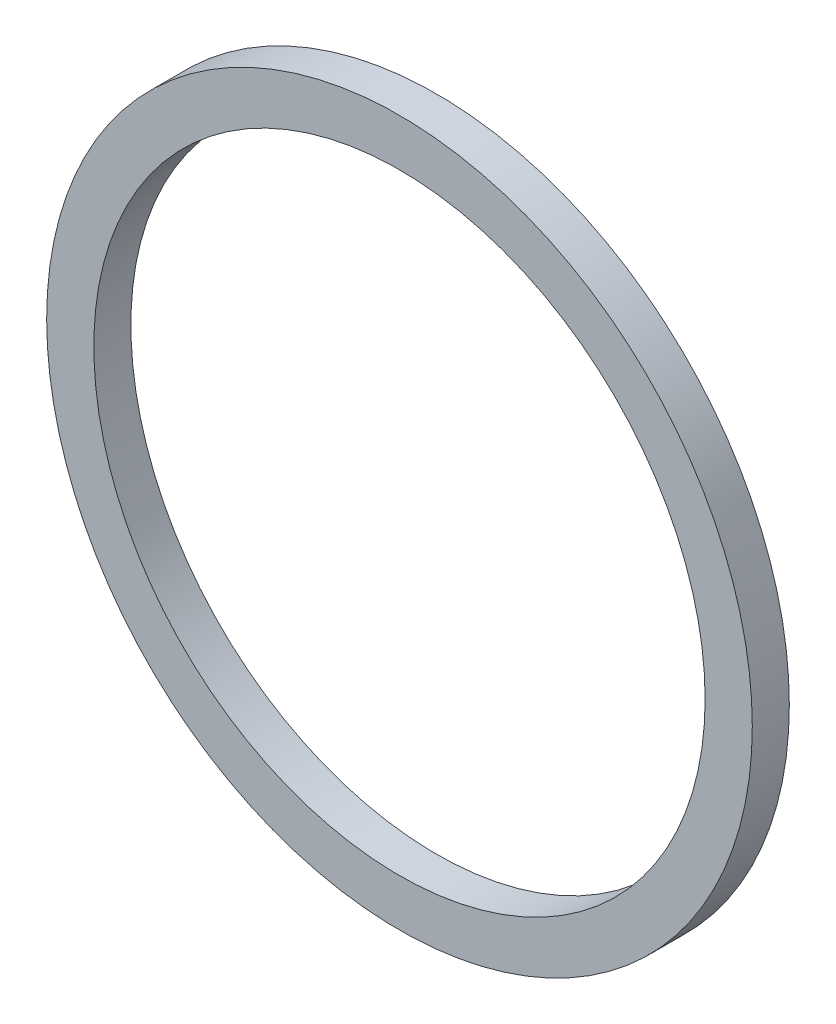
ISO-10303-21;
HEADER;
FILE_DESCRIPTION(('STEP AP214'),'2;1');
FILE_NAME('part.step','',(''),(''),'','','');
FILE_SCHEMA(('AUTOMOTIVE_DESIGN { 1 0 10303 214 1 1 1 1 }'));
ENDSEC;
DATA;
#1=APPLICATION_CONTEXT('core data for automotive mechanical design processes');
#2=APPLICATION_PROTOCOL_DEFINITION('international standard','automotive_design',2000,#1);
#3=PRODUCT_CONTEXT('',#1,'mechanical');
#4=PRODUCT('Part','Part','',(#3));
#5=PRODUCT_RELATED_PRODUCT_CATEGORY('part','',(#4));
#6=PRODUCT_DEFINITION_FORMATION('','',#4);
#7=PRODUCT_DEFINITION_CONTEXT('part definition',#1,'design');
#8=PRODUCT_DEFINITION('design','',#6,#7);
#9=PRODUCT_DEFINITION_SHAPE('','',#8);
#10=(LENGTH_UNIT() NAMED_UNIT(*) SI_UNIT(.MILLI.,.METRE.));
#11=(NAMED_UNIT(*) PLANE_ANGLE_UNIT() SI_UNIT($,.RADIAN.));
#12=(NAMED_UNIT(*) SI_UNIT($,.STERADIAN.) SOLID_ANGLE_UNIT());
#13=UNCERTAINTY_MEASURE_WITH_UNIT(LENGTH_MEASURE(1.E-05),#10,'distance_accuracy_value','');
#14=(GEOMETRIC_REPRESENTATION_CONTEXT(3) GLOBAL_UNCERTAINTY_ASSIGNED_CONTEXT((#13)) GLOBAL_UNIT_ASSIGNED_CONTEXT((#10,
#11,#12)) REPRESENTATION_CONTEXT('',''));
#15=CARTESIAN_POINT('',(0.,0.,0.));
#16=DIRECTION('',(0.,0.,1.));
#17=DIRECTION('',(1.,0.,0.));
#18=AXIS2_PLACEMENT_3D('',#15,#16,#17);
#19=CARTESIAN_POINT('',(0.,0.,-2.2));
#20=DIRECTION('',(0.,0.,1.));
#21=DIRECTION('',(1.,0.,0.));
#22=AXIS2_PLACEMENT_3D('',#19,#20,#21);
#23=CYLINDRICAL_SURFACE('',#22,20.95);
#24=CARTESIAN_POINT('',(0.,0.,-2.2));
#25=DIRECTION('',(0.,0.,1.));
#26=DIRECTION('',(1.,0.,0.));
#27=AXIS2_PLACEMENT_3D('',#24,#25,#26);
#28=CIRCLE('',#27,20.95);
#29=CARTESIAN_POINT('',(20.95,0.,-2.2));
#30=VERTEX_POINT('',#29);
#31=EDGE_CURVE('E10',#30,#30,#28,.T.);
#32=ORIENTED_EDGE('',*,*,#31,.T.);
#33=EDGE_LOOP('',(#32));
#34=FACE_BOUND('',#33,.T.);
#35=CARTESIAN_POINT('',(0.,0.,0.));
#36=DIRECTION('',(0.,0.,1.));
#37=DIRECTION('',(1.,0.,0.));
#38=AXIS2_PLACEMENT_3D('',#35,#36,#37);
#39=CIRCLE('',#38,20.95);
#40=CARTESIAN_POINT('',(20.95,0.,0.));
#41=VERTEX_POINT('',#40);
#42=EDGE_CURVE('E36',#41,#41,#39,.T.);
#43=ORIENTED_EDGE('',*,*,#42,.F.);
#44=EDGE_LOOP('',(#43));
#45=FACE_BOUND('',#44,.T.);
#46=ADVANCED_FACE('F33',(#34,#45),#23,.T.);
#47=CARTESIAN_POINT('',(0.,0.,-2.2));
#48=DIRECTION('',(0.,0.,1.));
#49=DIRECTION('',(1.,0.,0.));
#50=AXIS2_PLACEMENT_3D('',#47,#48,#49);
#51=PLANE('',#50);
#52=CARTESIAN_POINT('',(0.,0.,-2.2));
#53=DIRECTION('',(0.,0.,1.));
#54=DIRECTION('',(1.,0.,0.));
#55=AXIS2_PLACEMENT_3D('',#52,#53,#54);
#56=CIRCLE('',#55,18.15);
#57=CARTESIAN_POINT('',(18.15,0.,-2.2));
#58=VERTEX_POINT('',#57);
#59=EDGE_CURVE('E43',#58,#58,#56,.T.);
#60=ORIENTED_EDGE('',*,*,#59,.T.);
#61=EDGE_LOOP('',(#60));
#62=FACE_BOUND('',#61,.T.);
#63=ORIENTED_EDGE('',*,*,#31,.F.);
#64=EDGE_LOOP('',(#63));
#65=FACE_BOUND('',#64,.T.);
#66=ADVANCED_FACE('F51',(#62,#65),#51,.F.);
#67=CARTESIAN_POINT('',(0.,0.,0.));
#68=DIRECTION('',(0.,0.,1.));
#69=DIRECTION('',(1.,0.,0.));
#70=AXIS2_PLACEMENT_3D('',#67,#68,#69);
#71=PLANE('',#70);
#72=CARTESIAN_POINT('',(0.,0.,0.));
#73=DIRECTION('',(0.,0.,1.));
#74=DIRECTION('',(1.,0.,0.));
#75=AXIS2_PLACEMENT_3D('',#72,#73,#74);
#76=CIRCLE('',#75,18.15);
#77=CARTESIAN_POINT('',(18.15,0.,0.));
#78=VERTEX_POINT('',#77);
#79=EDGE_CURVE('E45',#78,#78,#76,.T.);
#80=ORIENTED_EDGE('',*,*,#79,.F.);
#81=EDGE_LOOP('',(#80));
#82=FACE_BOUND('',#81,.T.);
#83=ORIENTED_EDGE('',*,*,#42,.T.);
#84=EDGE_LOOP('',(#83));
#85=FACE_BOUND('',#84,.T.);
#86=ADVANCED_FACE('F57',(#82,#85),#71,.T.);
#87=CARTESIAN_POINT('',(0.,0.,-2.2));
#88=DIRECTION('',(0.,0.,1.));
#89=DIRECTION('',(1.,0.,0.));
#90=AXIS2_PLACEMENT_3D('',#87,#88,#89);
#91=CYLINDRICAL_SURFACE('',#90,18.15);
#92=ORIENTED_EDGE('',*,*,#59,.F.);
#93=EDGE_LOOP('',(#92));
#94=FACE_BOUND('',#93,.T.);
#95=ORIENTED_EDGE('',*,*,#79,.T.);
#96=EDGE_LOOP('',(#95));
#97=FACE_BOUND('',#96,.T.);
#98=ADVANCED_FACE('F54',(#94,#97),#91,.F.);
#99=CLOSED_SHELL('',(#46,#66,#86,#98));
#100=MANIFOLD_SOLID_BREP('B2',#99);
#101=ADVANCED_BREP_SHAPE_REPRESENTATION('',(#18,#100),#14);
#102=SHAPE_DEFINITION_REPRESENTATION(#9,#101);
ENDSEC;
END-ISO-10303-21;
